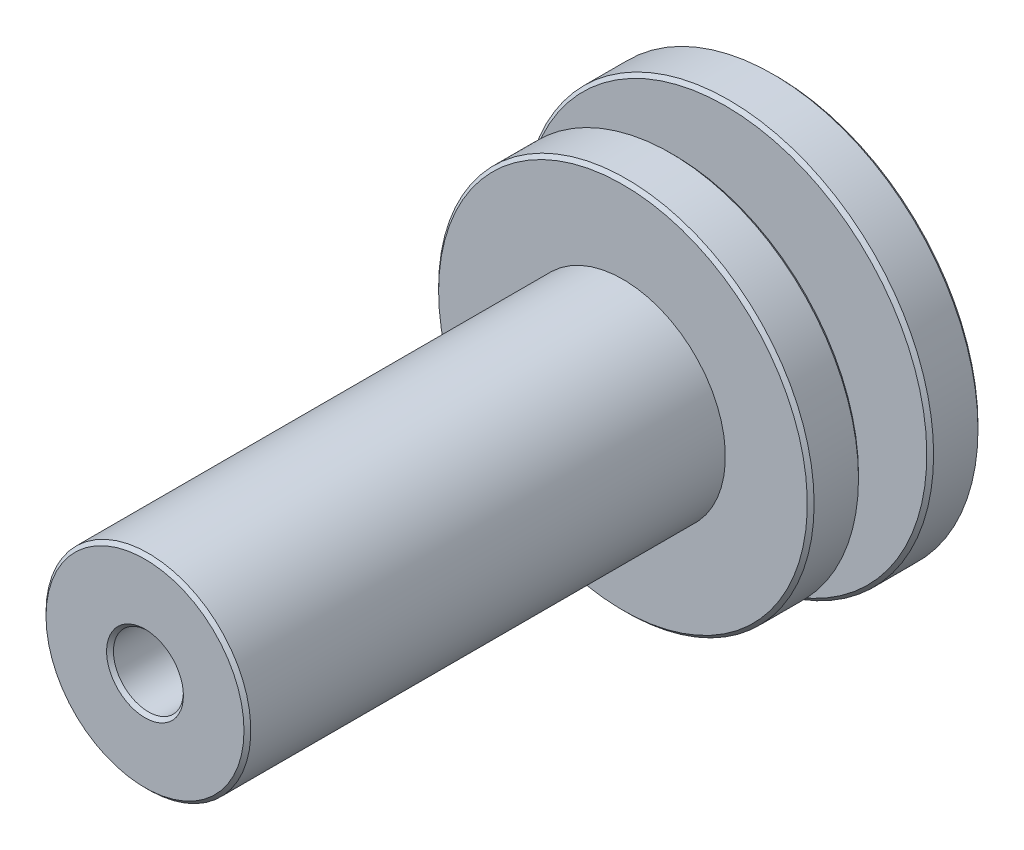
ISO-10303-21;
HEADER;
FILE_DESCRIPTION(('STEP AP214'),'2;1');
FILE_NAME('part.step','',(''),(''),'','','');
FILE_SCHEMA(('AUTOMOTIVE_DESIGN { 1 0 10303 214 1 1 1 1 }'));
ENDSEC;
DATA;
#1=APPLICATION_CONTEXT('core data for automotive mechanical design processes');
#2=APPLICATION_PROTOCOL_DEFINITION('international standard','automotive_design',2000,#1);
#3=PRODUCT_CONTEXT('',#1,'mechanical');
#4=PRODUCT('Part','Part','',(#3));
#5=PRODUCT_RELATED_PRODUCT_CATEGORY('part','',(#4));
#6=PRODUCT_DEFINITION_FORMATION('','',#4);
#7=PRODUCT_DEFINITION_CONTEXT('part definition',#1,'design');
#8=PRODUCT_DEFINITION('design','',#6,#7);
#9=PRODUCT_DEFINITION_SHAPE('','',#8);
#10=(LENGTH_UNIT() NAMED_UNIT(*) SI_UNIT(.MILLI.,.METRE.));
#11=(NAMED_UNIT(*) PLANE_ANGLE_UNIT() SI_UNIT($,.RADIAN.));
#12=(NAMED_UNIT(*) SI_UNIT($,.STERADIAN.) SOLID_ANGLE_UNIT());
#13=UNCERTAINTY_MEASURE_WITH_UNIT(LENGTH_MEASURE(1.E-05),#10,'distance_accuracy_value','');
#14=(GEOMETRIC_REPRESENTATION_CONTEXT(3) GLOBAL_UNCERTAINTY_ASSIGNED_CONTEXT((#13)) GLOBAL_UNIT_ASSIGNED_CONTEXT((#10,
#11,#12)) REPRESENTATION_CONTEXT('',''));
#15=CARTESIAN_POINT('',(0.,0.,0.));
#16=DIRECTION('',(0.,0.,1.));
#17=DIRECTION('',(1.,0.,0.));
#18=AXIS2_PLACEMENT_3D('',#15,#16,#17);
#19=CARTESIAN_POINT('',(0.,0.,-1.5));
#20=DIRECTION('',(0.,0.,-1.));
#21=DIRECTION('',(-1.,0.,0.));
#22=AXIS2_PLACEMENT_3D('',#19,#20,#21);
#23=PLANE('',#22);
#24=CARTESIAN_POINT('',(0.,0.,-1.50000000007822));
#25=DIRECTION('',(0.,0.,1.));
#26=DIRECTION('',(1.,0.,0.));
#27=AXIS2_PLACEMENT_3D('',#24,#25,#26);
#28=CIRCLE('',#27,5.89999999999691);
#29=CARTESIAN_POINT('',(5.89999999999691,0.,-1.50000000007822));
#30=VERTEX_POINT('',#29);
#31=EDGE_CURVE('E18',#30,#30,#28,.T.);
#32=ORIENTED_EDGE('',*,*,#31,.F.);
#33=EDGE_LOOP('',(#32));
#34=FACE_BOUND('',#33,.T.);
#35=ADVANCED_FACE('F15',(#34),#23,.T.);
#36=CARTESIAN_POINT('',(0.,0.,-1.40000000004648));
#37=DIRECTION('',(0.,0.,1.));
#38=DIRECTION('',(1.,0.,0.));
#39=AXIS2_PLACEMENT_3D('',#36,#37,#38);
#40=CONICAL_SURFACE('',#39,6.00000000002865,0.785398163397448);
#41=ORIENTED_EDGE('',*,*,#31,.T.);
#42=EDGE_LOOP('',(#41));
#43=FACE_BOUND('',#42,.T.);
#44=CARTESIAN_POINT('',(0.,0.,-1.4));
#45=DIRECTION('',(0.,0.,1.));
#46=DIRECTION('',(1.,0.,0.));
#47=AXIS2_PLACEMENT_3D('',#44,#45,#46);
#48=CIRCLE('',#47,6.);
#49=CARTESIAN_POINT('',(6.,0.,-1.4));
#50=VERTEX_POINT('',#49);
#51=EDGE_CURVE('E31',#50,#50,#48,.T.);
#52=ORIENTED_EDGE('',*,*,#51,.F.);
#53=EDGE_LOOP('',(#52));
#54=FACE_BOUND('',#53,.T.);
#55=ADVANCED_FACE('F227',(#43,#54),#40,.T.);
#56=CARTESIAN_POINT('',(0.,0.,-1.5));
#57=DIRECTION('',(0.,0.,1.));
#58=DIRECTION('',(1.,0.,0.));
#59=AXIS2_PLACEMENT_3D('',#56,#57,#58);
#60=CYLINDRICAL_SURFACE('',#59,6.);
#61=ORIENTED_EDGE('',*,*,#51,.T.);
#62=EDGE_LOOP('',(#61));
#63=FACE_BOUND('',#62,.T.);
#64=CARTESIAN_POINT('',(0.,0.,-0.0999999999748979));
#65=DIRECTION('',(0.,0.,-1.));
#66=DIRECTION('',(-1.,0.,0.));
#67=AXIS2_PLACEMENT_3D('',#64,#65,#66);
#68=CIRCLE('',#67,6.00000000002865);
#69=CARTESIAN_POINT('',(-6.00000000002865,0.,-0.0999999999748979));
#70=VERTEX_POINT('',#69);
#71=EDGE_CURVE('E57',#70,#70,#68,.F.);
#72=ORIENTED_EDGE('',*,*,#71,.F.);
#73=EDGE_LOOP('',(#72));
#74=FACE_BOUND('',#73,.T.);
#75=ADVANCED_FACE('F219',(#63,#74),#60,.T.);
#76=CARTESIAN_POINT('',(0.,0.,-0.0999999999748979));
#77=DIRECTION('',(0.,0.,-1.));
#78=DIRECTION('',(0.,1.,0.));
#79=AXIS2_PLACEMENT_3D('',#76,#77,#78);
#80=CONICAL_SURFACE('',#79,6.00000000002865,0.785398163397448);
#81=CARTESIAN_POINT('',(0.,0.,5.6843418860808E-11));
#82=DIRECTION('',(0.,0.,-1.));
#83=DIRECTION('',(0.,1.,0.));
#84=AXIS2_PLACEMENT_3D('',#81,#82,#83);
#85=CIRCLE('',#84,5.89999999999691);
#86=CARTESIAN_POINT('',(0.,5.89999999999691,5.68434255241339E-11));
#87=VERTEX_POINT('',#86);
#88=EDGE_CURVE('E55',#87,#87,#85,.T.);
#89=ORIENTED_EDGE('',*,*,#88,.T.);
#90=EDGE_LOOP('',(#89));
#91=FACE_BOUND('',#90,.T.);
#92=ORIENTED_EDGE('',*,*,#71,.T.);
#93=EDGE_LOOP('',(#92));
#94=FACE_BOUND('',#93,.T.);
#95=ADVANCED_FACE('F210',(#91,#94),#80,.T.);
#96=CARTESIAN_POINT('',(0.,0.,0.));
#97=DIRECTION('',(0.,0.,-1.));
#98=DIRECTION('',(-1.,0.,0.));
#99=AXIS2_PLACEMENT_3D('',#96,#97,#98);
#100=PLANE('',#99);
#101=CARTESIAN_POINT('',(0.,0.,0.));
#102=DIRECTION('',(0.,0.,-1.));
#103=DIRECTION('',(-1.,0.,0.));
#104=AXIS2_PLACEMENT_3D('',#101,#102,#103);
#105=CIRCLE('',#104,2.3);
#106=CARTESIAN_POINT('',(-2.3,0.,0.));
#107=VERTEX_POINT('',#106);
#108=EDGE_CURVE('E53',#107,#107,#105,.F.);
#109=ORIENTED_EDGE('',*,*,#108,.F.);
#110=EDGE_LOOP('',(#109));
#111=FACE_BOUND('',#110,.T.);
#112=ORIENTED_EDGE('',*,*,#88,.F.);
#113=EDGE_LOOP('',(#112));
#114=FACE_BOUND('',#113,.T.);
#115=ADVANCED_FACE('F201',(#111,#114),#100,.F.);
#116=CARTESIAN_POINT('',(0.,0.,1.5));
#117=DIRECTION('',(0.,0.,-1.));
#118=DIRECTION('',(-1.,0.,0.));
#119=AXIS2_PLACEMENT_3D('',#116,#117,#118);
#120=CYLINDRICAL_SURFACE('',#119,2.3);
#121=CARTESIAN_POINT('',(0.,0.,1.5));
#122=DIRECTION('',(0.,0.,-1.));
#123=DIRECTION('',(-1.,0.,0.));
#124=AXIS2_PLACEMENT_3D('',#121,#122,#123);
#125=CIRCLE('',#124,2.3);
#126=CARTESIAN_POINT('',(-2.3,0.,1.5));
#127=VERTEX_POINT('',#126);
#128=EDGE_CURVE('E50',#127,#127,#125,.T.);
#129=ORIENTED_EDGE('',*,*,#128,.T.);
#130=EDGE_LOOP('',(#129));
#131=FACE_BOUND('',#130,.T.);
#132=ORIENTED_EDGE('',*,*,#108,.T.);
#133=EDGE_LOOP('',(#132));
#134=FACE_BOUND('',#133,.T.);
#135=ADVANCED_FACE('F192',(#131,#134),#120,.T.);
#136=CARTESIAN_POINT('',(0.,0.,9.5));
#137=DIRECTION('',(0.,0.,1.));
#138=DIRECTION('',(1.,0.,0.));
#139=AXIS2_PLACEMENT_3D('',#136,#137,#138);
#140=PLANE('',#139);
#141=CARTESIAN_POINT('',(0.,0.,9.5));
#142=DIRECTION('',(0.,0.,1.));
#143=DIRECTION('',(1.,0.,0.));
#144=AXIS2_PLACEMENT_3D('',#141,#142,#143);
#145=CIRCLE('',#144,1.025);
#146=CARTESIAN_POINT('',(1.025,0.,9.5));
#147=VERTEX_POINT('',#146);
#148=EDGE_CURVE('E47',#147,#147,#145,.T.);
#149=ORIENTED_EDGE('',*,*,#148,.T.);
#150=EDGE_LOOP('',(#149));
#151=FACE_BOUND('',#150,.T.);
#152=ADVANCED_FACE('F183',(#151),#140,.T.);
#153=CARTESIAN_POINT('',(0.,0.,1.5));
#154=DIRECTION('',(0.,0.,1.));
#155=DIRECTION('',(1.,0.,0.));
#156=AXIS2_PLACEMENT_3D('',#153,#154,#155);
#157=PLANE('',#156);
#158=ORIENTED_EDGE('',*,*,#128,.F.);
#159=EDGE_LOOP('',(#158));
#160=FACE_BOUND('',#159,.T.);
#161=CARTESIAN_POINT('',(0.,0.,1.50000000002137));
#162=DIRECTION('',(0.,0.,1.));
#163=DIRECTION('',(1.,0.,0.));
#164=AXIS2_PLACEMENT_3D('',#161,#162,#163);
#165=CIRCLE('',#164,5.39999999995189);
#166=CARTESIAN_POINT('',(5.39999999995189,0.,1.50000000002137));
#167=VERTEX_POINT('',#166);
#168=EDGE_CURVE('E43',#167,#167,#165,.T.);
#169=ORIENTED_EDGE('',*,*,#168,.F.);
#170=EDGE_LOOP('',(#169));
#171=FACE_BOUND('',#170,.T.);
#172=ADVANCED_FACE('F94',(#160,#171),#157,.F.);
#173=CARTESIAN_POINT('',(0.,0.,9.5));
#174=DIRECTION('',(0.,0.,1.));
#175=DIRECTION('',(1.,0.,0.));
#176=AXIS2_PLACEMENT_3D('',#173,#174,#175);
#177=CYLINDRICAL_SURFACE('',#176,1.025);
#178=ORIENTED_EDGE('',*,*,#148,.F.);
#179=EDGE_LOOP('',(#178));
#180=FACE_BOUND('',#179,.T.);
#181=CARTESIAN_POINT('',(0.,0.,16.900000000021));
#182=DIRECTION('',(0.,0.,1.));
#183=DIRECTION('',(1.,0.,0.));
#184=AXIS2_PLACEMENT_3D('',#181,#182,#183);
#185=CIRCLE('',#184,1.02499999997008);
#186=CARTESIAN_POINT('',(1.02499999997008,0.,16.900000000021));
#187=VERTEX_POINT('',#186);
#188=EDGE_CURVE('E46',#187,#187,#185,.T.);
#189=ORIENTED_EDGE('',*,*,#188,.T.);
#190=EDGE_LOOP('',(#189));
#191=FACE_BOUND('',#190,.T.);
#192=ADVANCED_FACE('F84',(#180,#191),#177,.F.);
#193=CARTESIAN_POINT('',(0.,0.,1.59999999999627));
#194=DIRECTION('',(0.,0.,1.));
#195=DIRECTION('',(1.,0.,0.));
#196=AXIS2_PLACEMENT_3D('',#193,#194,#195);
#197=CONICAL_SURFACE('',#196,5.49999999992679,0.785398163397448);
#198=ORIENTED_EDGE('',*,*,#168,.T.);
#199=EDGE_LOOP('',(#198));
#200=FACE_BOUND('',#199,.T.);
#201=CARTESIAN_POINT('',(0.,0.,1.6));
#202=DIRECTION('',(0.,0.,-1.));
#203=DIRECTION('',(-1.,0.,0.));
#204=AXIS2_PLACEMENT_3D('',#201,#202,#203);
#205=CIRCLE('',#204,5.5);
#206=CARTESIAN_POINT('',(-5.5,0.,1.6));
#207=VERTEX_POINT('',#206);
#208=EDGE_CURVE('E42',#207,#207,#205,.F.);
#209=ORIENTED_EDGE('',*,*,#208,.F.);
#210=EDGE_LOOP('',(#209));
#211=FACE_BOUND('',#210,.T.);
#212=ADVANCED_FACE('F82',(#200,#211),#197,.T.);
#213=CARTESIAN_POINT('',(0.,0.,17.0000000000528));
#214=DIRECTION('',(0.,0.,1.));
#215=DIRECTION('',(1.,0.,0.));
#216=AXIS2_PLACEMENT_3D('',#213,#214,#215);
#217=CONICAL_SURFACE('',#216,1.12500000000182,0.785398163113231);
#218=ORIENTED_EDGE('',*,*,#188,.F.);
#219=EDGE_LOOP('',(#218));
#220=FACE_BOUND('',#219,.T.);
#221=CARTESIAN_POINT('',(0.,0.,17.0000000000528));
#222=DIRECTION('',(0.,0.,1.));
#223=DIRECTION('',(1.,0.,0.));
#224=AXIS2_PLACEMENT_3D('',#221,#222,#223);
#225=CIRCLE('',#224,1.12500000000182);
#226=CARTESIAN_POINT('',(1.12500000000182,0.,17.0000000000528));
#227=VERTEX_POINT('',#226);
#228=EDGE_CURVE('E39',#227,#227,#225,.F.);
#229=ORIENTED_EDGE('',*,*,#228,.F.);
#230=EDGE_LOOP('',(#229));
#231=FACE_BOUND('',#230,.T.);
#232=ADVANCED_FACE('F78',(#220,#231),#217,.F.);
#233=CARTESIAN_POINT('',(0.,0.,3.));
#234=DIRECTION('',(0.,0.,-1.));
#235=DIRECTION('',(-1.,0.,0.));
#236=AXIS2_PLACEMENT_3D('',#233,#234,#235);
#237=CYLINDRICAL_SURFACE('',#236,5.5);
#238=CARTESIAN_POINT('',(0.,0.,2.900000000011));
#239=DIRECTION('',(0.,0.,-1.));
#240=DIRECTION('',(-1.,0.,0.));
#241=AXIS2_PLACEMENT_3D('',#238,#239,#240);
#242=CIRCLE('',#241,5.50000000004047);
#243=CARTESIAN_POINT('',(-5.50000000004047,0.,2.900000000011));
#244=VERTEX_POINT('',#243);
#245=EDGE_CURVE('E38',#244,#244,#242,.F.);
#246=ORIENTED_EDGE('',*,*,#245,.F.);
#247=EDGE_LOOP('',(#246));
#248=FACE_BOUND('',#247,.T.);
#249=ORIENTED_EDGE('',*,*,#208,.T.);
#250=EDGE_LOOP('',(#249));
#251=FACE_BOUND('',#250,.T.);
#252=ADVANCED_FACE('F74',(#248,#251),#237,.T.);
#253=CARTESIAN_POINT('',(0.,0.,17.));
#254=DIRECTION('',(0.,0.,1.));
#255=DIRECTION('',(1.,0.,0.));
#256=AXIS2_PLACEMENT_3D('',#253,#254,#255);
#257=PLANE('',#256);
#258=ORIENTED_EDGE('',*,*,#228,.T.);
#259=EDGE_LOOP('',(#258));
#260=FACE_BOUND('',#259,.T.);
#261=CARTESIAN_POINT('',(0.,0.,16.9999999999391));
#262=DIRECTION('',(0.,0.,-1.));
#263=DIRECTION('',(-1.,0.,0.));
#264=AXIS2_PLACEMENT_3D('',#261,#262,#263);
#265=CIRCLE('',#264,2.900000000011);
#266=CARTESIAN_POINT('',(-2.900000000011,0.,16.9999999999391));
#267=VERTEX_POINT('',#266);
#268=EDGE_CURVE('E35',#267,#267,#265,.T.);
#269=ORIENTED_EDGE('',*,*,#268,.F.);
#270=EDGE_LOOP('',(#269));
#271=FACE_BOUND('',#270,.T.);
#272=ADVANCED_FACE('F77',(#260,#271),#257,.T.);
#273=CARTESIAN_POINT('',(0.,0.,2.900000000011));
#274=DIRECTION('',(0.,0.,-1.));
#275=DIRECTION('',(-1.,0.,0.));
#276=AXIS2_PLACEMENT_3D('',#273,#274,#275);
#277=CONICAL_SURFACE('',#276,5.50000000004047,0.785398163397448);
#278=CARTESIAN_POINT('',(0.,0.,3.00000000004275));
#279=DIRECTION('',(0.,0.,-1.));
#280=DIRECTION('',(-1.,0.,0.));
#281=AXIS2_PLACEMENT_3D('',#278,#279,#280);
#282=CIRCLE('',#281,5.40000000000873);
#283=CARTESIAN_POINT('',(-5.40000000000873,0.,3.00000000004275));
#284=VERTEX_POINT('',#283);
#285=EDGE_CURVE('E27',#284,#284,#282,.T.);
#286=ORIENTED_EDGE('',*,*,#285,.T.);
#287=EDGE_LOOP('',(#286));
#288=FACE_BOUND('',#287,.T.);
#289=ORIENTED_EDGE('',*,*,#245,.T.);
#290=EDGE_LOOP('',(#289));
#291=FACE_BOUND('',#290,.T.);
#292=ADVANCED_FACE('F72',(#288,#291),#277,.T.);
#293=CARTESIAN_POINT('',(0.,0.,16.8999999999073));
#294=DIRECTION('',(0.,0.,-1.));
#295=DIRECTION('',(-1.,0.,0.));
#296=AXIS2_PLACEMENT_3D('',#293,#294,#295);
#297=CONICAL_SURFACE('',#296,3.00000000004275,0.785398163397448);
#298=CARTESIAN_POINT('',(0.,0.,16.9));
#299=DIRECTION('',(0.,0.,-1.));
#300=DIRECTION('',(-1.,0.,0.));
#301=AXIS2_PLACEMENT_3D('',#298,#299,#300);
#302=CIRCLE('',#301,3.);
#303=CARTESIAN_POINT('',(-3.,0.,16.9));
#304=VERTEX_POINT('',#303);
#305=EDGE_CURVE('E22',#304,#304,#302,.T.);
#306=ORIENTED_EDGE('',*,*,#305,.F.);
#307=EDGE_LOOP('',(#306));
#308=FACE_BOUND('',#307,.T.);
#309=ORIENTED_EDGE('',*,*,#268,.T.);
#310=EDGE_LOOP('',(#309));
#311=FACE_BOUND('',#310,.T.);
#312=ADVANCED_FACE('F104',(#308,#311),#297,.T.);
#313=CARTESIAN_POINT('',(0.,0.,3.));
#314=DIRECTION('',(0.,0.,-1.));
#315=DIRECTION('',(-1.,0.,0.));
#316=AXIS2_PLACEMENT_3D('',#313,#314,#315);
#317=PLANE('',#316);
#318=CARTESIAN_POINT('',(0.,0.,3.));
#319=DIRECTION('',(0.,0.,-1.));
#320=DIRECTION('',(-1.,0.,0.));
#321=AXIS2_PLACEMENT_3D('',#318,#319,#320);
#322=CIRCLE('',#321,3.);
#323=CARTESIAN_POINT('',(-3.,0.,3.));
#324=VERTEX_POINT('',#323);
#325=EDGE_CURVE('E10',#324,#324,#322,.F.);
#326=ORIENTED_EDGE('',*,*,#325,.F.);
#327=EDGE_LOOP('',(#326));
#328=FACE_BOUND('',#327,.T.);
#329=ORIENTED_EDGE('',*,*,#285,.F.);
#330=EDGE_LOOP('',(#329));
#331=FACE_BOUND('',#330,.T.);
#332=ADVANCED_FACE('F99',(#328,#331),#317,.F.);
#333=CARTESIAN_POINT('',(0.,0.,17.));
#334=DIRECTION('',(0.,0.,-1.));
#335=DIRECTION('',(-1.,0.,0.));
#336=AXIS2_PLACEMENT_3D('',#333,#334,#335);
#337=CYLINDRICAL_SURFACE('',#336,3.);
#338=ORIENTED_EDGE('',*,*,#325,.T.);
#339=EDGE_LOOP('',(#338));
#340=FACE_BOUND('',#339,.T.);
#341=ORIENTED_EDGE('',*,*,#305,.T.);
#342=EDGE_LOOP('',(#341));
#343=FACE_BOUND('',#342,.T.);
#344=ADVANCED_FACE('F97',(#340,#343),#337,.T.);
#345=CLOSED_SHELL('',(#35,#55,#75,#95,#115,#135,#152,#172,#192,#212,#232,#252,#272,#292,#312,
#332,#344));
#346=MANIFOLD_SOLID_BREP('B1',#345);
#347=ADVANCED_BREP_SHAPE_REPRESENTATION('',(#18,#346),#14);
#348=SHAPE_DEFINITION_REPRESENTATION(#9,#347);
ENDSEC;
END-ISO-10303-21;
